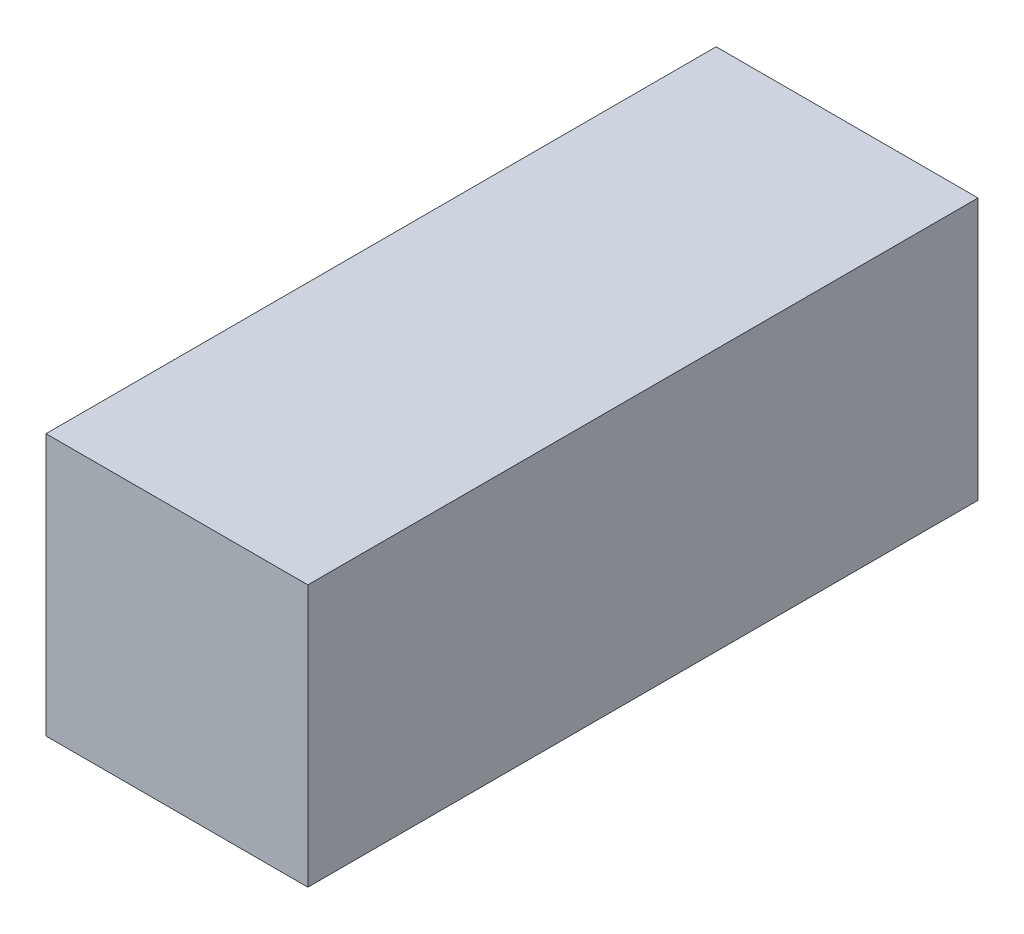
ISO-10303-21;
HEADER;
FILE_DESCRIPTION(('STEP AP214'),'2;1');
FILE_NAME('part.step','',(''),(''),'','','');
FILE_SCHEMA(('AUTOMOTIVE_DESIGN { 1 0 10303 214 1 1 1 1 }'));
ENDSEC;
DATA;
#1=APPLICATION_CONTEXT('core data for automotive mechanical design processes');
#2=APPLICATION_PROTOCOL_DEFINITION('international standard','automotive_design',2000,#1);
#3=PRODUCT_CONTEXT('',#1,'mechanical');
#4=PRODUCT('Part','Part','',(#3));
#5=PRODUCT_RELATED_PRODUCT_CATEGORY('part','',(#4));
#6=PRODUCT_DEFINITION_FORMATION('','',#4);
#7=PRODUCT_DEFINITION_CONTEXT('part definition',#1,'design');
#8=PRODUCT_DEFINITION('design','',#6,#7);
#9=PRODUCT_DEFINITION_SHAPE('','',#8);
#10=(LENGTH_UNIT() NAMED_UNIT(*) SI_UNIT(.MILLI.,.METRE.));
#11=(NAMED_UNIT(*) PLANE_ANGLE_UNIT() SI_UNIT($,.RADIAN.));
#12=(NAMED_UNIT(*) SI_UNIT($,.STERADIAN.) SOLID_ANGLE_UNIT());
#13=UNCERTAINTY_MEASURE_WITH_UNIT(LENGTH_MEASURE(1.E-05),#10,'distance_accuracy_value','');
#14=(GEOMETRIC_REPRESENTATION_CONTEXT(3) GLOBAL_UNCERTAINTY_ASSIGNED_CONTEXT((#13)) GLOBAL_UNIT_ASSIGNED_CONTEXT((#10,
#11,#12)) REPRESENTATION_CONTEXT('',''));
#15=CARTESIAN_POINT('',(0.,0.,0.));
#16=DIRECTION('',(0.,0.,1.));
#17=DIRECTION('',(1.,0.,0.));
#18=AXIS2_PLACEMENT_3D('',#15,#16,#17);
#19=CARTESIAN_POINT('',(-12.7,12.7,65.));
#20=DIRECTION('',(1.,0.,0.));
#21=DIRECTION('',(0.,1.,0.));
#22=AXIS2_PLACEMENT_3D('',#19,#20,#21);
#23=PLANE('',#22);
#24=DIRECTION('',(0.,-1.,0.));
#25=VECTOR('',#24,1.);
#26=CARTESIAN_POINT('',(-12.7,12.7,0.));
#27=LINE('',#26,#25);
#28=CARTESIAN_POINT('',(-12.7,12.7,0.));
#29=VERTEX_POINT('',#28);
#30=CARTESIAN_POINT('',(-12.7,-12.7,0.));
#31=VERTEX_POINT('',#30);
#32=EDGE_CURVE('E98',#29,#31,#27,.T.);
#33=ORIENTED_EDGE('',*,*,#32,.T.);
#34=DIRECTION('',(0.,0.,-1.));
#35=VECTOR('',#34,1.);
#36=CARTESIAN_POINT('',(-12.7,-12.7,65.));
#37=LINE('',#36,#35);
#38=CARTESIAN_POINT('',(-12.7,-12.7,65.));
#39=VERTEX_POINT('',#38);
#40=EDGE_CURVE('E11',#39,#31,#37,.T.);
#41=ORIENTED_EDGE('',*,*,#40,.F.);
#42=DIRECTION('',(0.,-1.,0.));
#43=VECTOR('',#42,1.);
#44=CARTESIAN_POINT('',(-12.7,12.7,65.));
#45=LINE('',#44,#43);
#46=CARTESIAN_POINT('',(-12.7,12.7,65.));
#47=VERTEX_POINT('',#46);
#48=EDGE_CURVE('E86',#47,#39,#45,.T.);
#49=ORIENTED_EDGE('',*,*,#48,.F.);
#50=DIRECTION('',(0.,0.,-1.));
#51=VECTOR('',#50,1.);
#52=CARTESIAN_POINT('',(-12.7,12.7,65.));
#53=LINE('',#52,#51);
#54=EDGE_CURVE('E94',#47,#29,#53,.T.);
#55=ORIENTED_EDGE('',*,*,#54,.T.);
#56=EDGE_LOOP('',(#33,#41,#49,#55));
#57=FACE_BOUND('',#56,.T.);
#58=ADVANCED_FACE('F35',(#57),#23,.F.);
#59=CARTESIAN_POINT('',(-12.7,-12.7,65.));
#60=DIRECTION('',(0.,1.,0.));
#61=DIRECTION('',(-1.,0.,0.));
#62=AXIS2_PLACEMENT_3D('',#59,#60,#61);
#63=PLANE('',#62);
#64=DIRECTION('',(1.,0.,0.));
#65=VECTOR('',#64,1.);
#66=CARTESIAN_POINT('',(-12.7,-12.7,0.));
#67=LINE('',#66,#65);
#68=CARTESIAN_POINT('',(12.7,-12.7,0.));
#69=VERTEX_POINT('',#68);
#70=EDGE_CURVE('E90',#31,#69,#67,.T.);
#71=ORIENTED_EDGE('',*,*,#70,.T.);
#72=DIRECTION('',(0.,0.,-1.));
#73=VECTOR('',#72,1.);
#74=CARTESIAN_POINT('',(12.7,-12.7,65.));
#75=LINE('',#74,#73);
#76=CARTESIAN_POINT('',(12.7,-12.7,65.));
#77=VERTEX_POINT('',#76);
#78=EDGE_CURVE('E43',#77,#69,#75,.T.);
#79=ORIENTED_EDGE('',*,*,#78,.F.);
#80=DIRECTION('',(1.,0.,0.));
#81=VECTOR('',#80,1.);
#82=CARTESIAN_POINT('',(-12.7,-12.7,65.));
#83=LINE('',#82,#81);
#84=EDGE_CURVE('E81',#39,#77,#83,.T.);
#85=ORIENTED_EDGE('',*,*,#84,.F.);
#86=ORIENTED_EDGE('',*,*,#40,.T.);
#87=EDGE_LOOP('',(#71,#79,#85,#86));
#88=FACE_BOUND('',#87,.T.);
#89=ADVANCED_FACE('F89',(#88),#63,.F.);
#90=CARTESIAN_POINT('',(12.7,12.7,65.));
#91=DIRECTION('',(-1.,0.,0.));
#92=DIRECTION('',(0.,-1.,0.));
#93=AXIS2_PLACEMENT_3D('',#90,#91,#92);
#94=PLANE('',#93);
#95=DIRECTION('',(0.,1.,0.));
#96=VECTOR('',#95,1.);
#97=CARTESIAN_POINT('',(12.7,12.7,0.));
#98=LINE('',#97,#96);
#99=CARTESIAN_POINT('',(12.7,12.7,0.));
#100=VERTEX_POINT('',#99);
#101=EDGE_CURVE('E68',#69,#100,#98,.T.);
#102=ORIENTED_EDGE('',*,*,#101,.T.);
#103=DIRECTION('',(0.,0.,-1.));
#104=VECTOR('',#103,1.);
#105=CARTESIAN_POINT('',(12.7,12.7,65.));
#106=LINE('',#105,#104);
#107=CARTESIAN_POINT('',(12.7,12.7,65.));
#108=VERTEX_POINT('',#107);
#109=EDGE_CURVE('E91',#108,#100,#106,.T.);
#110=ORIENTED_EDGE('',*,*,#109,.F.);
#111=DIRECTION('',(0.,1.,0.));
#112=VECTOR('',#111,1.);
#113=CARTESIAN_POINT('',(12.7,12.7,65.));
#114=LINE('',#113,#112);
#115=EDGE_CURVE('E84',#77,#108,#114,.T.);
#116=ORIENTED_EDGE('',*,*,#115,.F.);
#117=ORIENTED_EDGE('',*,*,#78,.T.);
#118=EDGE_LOOP('',(#102,#110,#116,#117));
#119=FACE_BOUND('',#118,.T.);
#120=ADVANCED_FACE('F92',(#119),#94,.F.);
#121=CARTESIAN_POINT('',(-12.7,12.7,65.));
#122=DIRECTION('',(0.,-1.,0.));
#123=DIRECTION('',(1.,0.,0.));
#124=AXIS2_PLACEMENT_3D('',#121,#122,#123);
#125=PLANE('',#124);
#126=DIRECTION('',(-1.,0.,0.));
#127=VECTOR('',#126,1.);
#128=CARTESIAN_POINT('',(-12.7,12.7,0.));
#129=LINE('',#128,#127);
#130=EDGE_CURVE('E74',#100,#29,#129,.T.);
#131=ORIENTED_EDGE('',*,*,#130,.T.);
#132=ORIENTED_EDGE('',*,*,#54,.F.);
#133=DIRECTION('',(-1.,0.,0.));
#134=VECTOR('',#133,1.);
#135=CARTESIAN_POINT('',(-12.7,12.7,65.));
#136=LINE('',#135,#134);
#137=EDGE_CURVE('E51',#108,#47,#136,.T.);
#138=ORIENTED_EDGE('',*,*,#137,.F.);
#139=ORIENTED_EDGE('',*,*,#109,.T.);
#140=EDGE_LOOP('',(#131,#132,#138,#139));
#141=FACE_BOUND('',#140,.T.);
#142=ADVANCED_FACE('F105',(#141),#125,.F.);
#143=CARTESIAN_POINT('',(0.,0.,65.));
#144=DIRECTION('',(0.,0.,1.));
#145=DIRECTION('',(1.,0.,0.));
#146=AXIS2_PLACEMENT_3D('',#143,#144,#145);
#147=PLANE('',#146);
#148=ORIENTED_EDGE('',*,*,#48,.T.);
#149=ORIENTED_EDGE('',*,*,#84,.T.);
#150=ORIENTED_EDGE('',*,*,#115,.T.);
#151=ORIENTED_EDGE('',*,*,#137,.T.);
#152=EDGE_LOOP('',(#148,#149,#150,#151));
#153=FACE_BOUND('',#152,.T.);
#154=ADVANCED_FACE('F82',(#153),#147,.T.);
#155=CARTESIAN_POINT('',(0.,0.,0.));
#156=DIRECTION('',(0.,0.,1.));
#157=DIRECTION('',(1.,0.,0.));
#158=AXIS2_PLACEMENT_3D('',#155,#156,#157);
#159=PLANE('',#158);
#160=ORIENTED_EDGE('',*,*,#32,.F.);
#161=ORIENTED_EDGE('',*,*,#130,.F.);
#162=ORIENTED_EDGE('',*,*,#101,.F.);
#163=ORIENTED_EDGE('',*,*,#70,.F.);
#164=EDGE_LOOP('',(#160,#161,#162,#163));
#165=FACE_BOUND('',#164,.T.);
#166=ADVANCED_FACE('F108',(#165),#159,.F.);
#167=CLOSED_SHELL('',(#58,#89,#120,#142,#154,#166));
#168=MANIFOLD_SOLID_BREP('B2',#167);
#169=ADVANCED_BREP_SHAPE_REPRESENTATION('',(#18,#168),#14);
#170=SHAPE_DEFINITION_REPRESENTATION(#9,#169);
ENDSEC;
END-ISO-10303-21;
